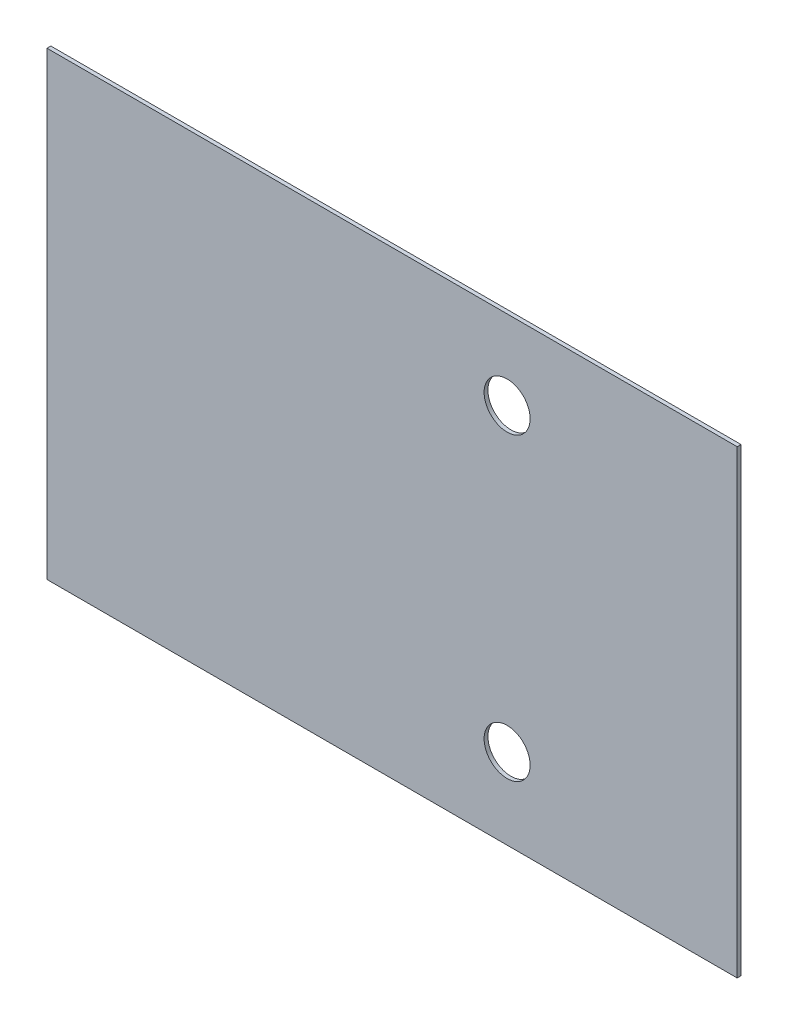
ISO-10303-21;
HEADER;
FILE_DESCRIPTION(('STEP AP214'),'2;1');
FILE_NAME('part.step','',(''),(''),'','','');
FILE_SCHEMA(('AUTOMOTIVE_DESIGN { 1 0 10303 214 1 1 1 1 }'));
ENDSEC;
DATA;
#1=APPLICATION_CONTEXT('core data for automotive mechanical design processes');
#2=APPLICATION_PROTOCOL_DEFINITION('international standard','automotive_design',2000,#1);
#3=PRODUCT_CONTEXT('',#1,'mechanical');
#4=PRODUCT('Part','Part','',(#3));
#5=PRODUCT_RELATED_PRODUCT_CATEGORY('part','',(#4));
#6=PRODUCT_DEFINITION_FORMATION('','',#4);
#7=PRODUCT_DEFINITION_CONTEXT('part definition',#1,'design');
#8=PRODUCT_DEFINITION('design','',#6,#7);
#9=PRODUCT_DEFINITION_SHAPE('','',#8);
#10=(LENGTH_UNIT() NAMED_UNIT(*) SI_UNIT(.MILLI.,.METRE.));
#11=(NAMED_UNIT(*) PLANE_ANGLE_UNIT() SI_UNIT($,.RADIAN.));
#12=(NAMED_UNIT(*) SI_UNIT($,.STERADIAN.) SOLID_ANGLE_UNIT());
#13=UNCERTAINTY_MEASURE_WITH_UNIT(LENGTH_MEASURE(1.E-05),#10,'distance_accuracy_value','');
#14=(GEOMETRIC_REPRESENTATION_CONTEXT(3) GLOBAL_UNCERTAINTY_ASSIGNED_CONTEXT((#13)) GLOBAL_UNIT_ASSIGNED_CONTEXT((#10,
#11,#12)) REPRESENTATION_CONTEXT('',''));
#15=CARTESIAN_POINT('',(0.,0.,0.));
#16=DIRECTION('',(0.,0.,1.));
#17=DIRECTION('',(1.,0.,0.));
#18=AXIS2_PLACEMENT_3D('',#15,#16,#17);
#19=CARTESIAN_POINT('',(475.545851528384,38.6462882096068,5.));
#20=DIRECTION('',(-1.,0.,0.));
#21=DIRECTION('',(0.,0.,1.));
#22=AXIS2_PLACEMENT_3D('',#19,#20,#21);
#23=PLANE('',#22);
#24=DIRECTION('',(0.,1.,0.));
#25=VECTOR('',#24,1.);
#26=CARTESIAN_POINT('',(475.545851528384,38.6462882096068,0.));
#27=LINE('',#26,#25);
#28=CARTESIAN_POINT('',(475.545851528384,38.6462882096068,0.));
#29=VERTEX_POINT('',#28);
#30=CARTESIAN_POINT('',(475.545851528384,638.646288209607,0.));
#31=VERTEX_POINT('',#30);
#32=EDGE_CURVE('E100',#29,#31,#27,.T.);
#33=ORIENTED_EDGE('',*,*,#32,.T.);
#34=DIRECTION('',(0.,0.,-1.));
#35=VECTOR('',#34,1.);
#36=CARTESIAN_POINT('',(475.545851528384,638.646288209607,5.));
#37=LINE('',#36,#35);
#38=CARTESIAN_POINT('',(475.545851528384,638.646288209607,5.));
#39=VERTEX_POINT('',#38);
#40=EDGE_CURVE('E11',#39,#31,#37,.T.);
#41=ORIENTED_EDGE('',*,*,#40,.F.);
#42=DIRECTION('',(0.,1.,0.));
#43=VECTOR('',#42,1.);
#44=CARTESIAN_POINT('',(475.545851528384,38.6462882096068,5.));
#45=LINE('',#44,#43);
#46=CARTESIAN_POINT('',(475.545851528384,38.6462882096068,5.));
#47=VERTEX_POINT('',#46);
#48=EDGE_CURVE('E88',#47,#39,#45,.T.);
#49=ORIENTED_EDGE('',*,*,#48,.F.);
#50=DIRECTION('',(0.,0.,-1.));
#51=VECTOR('',#50,1.);
#52=CARTESIAN_POINT('',(475.545851528384,38.6462882096068,5.));
#53=LINE('',#52,#51);
#54=EDGE_CURVE('E96',#47,#29,#53,.T.);
#55=ORIENTED_EDGE('',*,*,#54,.T.);
#56=EDGE_LOOP('',(#33,#41,#49,#55));
#57=FACE_BOUND('',#56,.T.);
#58=ADVANCED_FACE('F37',(#57),#23,.F.);
#59=CARTESIAN_POINT('',(475.545851528384,638.646288209607,5.));
#60=DIRECTION('',(0.,-1.,0.));
#61=DIRECTION('',(0.,0.,-1.));
#62=AXIS2_PLACEMENT_3D('',#59,#60,#61);
#63=PLANE('',#62);
#64=DIRECTION('',(-1.,0.,0.));
#65=VECTOR('',#64,1.);
#66=CARTESIAN_POINT('',(475.545851528384,638.646288209607,0.));
#67=LINE('',#66,#65);
#68=CARTESIAN_POINT('',(-424.454148471616,638.646288209607,0.));
#69=VERTEX_POINT('',#68);
#70=EDGE_CURVE('E92',#31,#69,#67,.T.);
#71=ORIENTED_EDGE('',*,*,#70,.T.);
#72=DIRECTION('',(0.,0.,-1.));
#73=VECTOR('',#72,1.);
#74=CARTESIAN_POINT('',(-424.454148471616,638.646288209607,5.));
#75=LINE('',#74,#73);
#76=CARTESIAN_POINT('',(-424.454148471616,638.646288209607,5.));
#77=VERTEX_POINT('',#76);
#78=EDGE_CURVE('E45',#77,#69,#75,.T.);
#79=ORIENTED_EDGE('',*,*,#78,.F.);
#80=DIRECTION('',(-1.,0.,0.));
#81=VECTOR('',#80,1.);
#82=CARTESIAN_POINT('',(475.545851528384,638.646288209607,5.));
#83=LINE('',#82,#81);
#84=EDGE_CURVE('E83',#39,#77,#83,.T.);
#85=ORIENTED_EDGE('',*,*,#84,.F.);
#86=ORIENTED_EDGE('',*,*,#40,.T.);
#87=EDGE_LOOP('',(#71,#79,#85,#86));
#88=FACE_BOUND('',#87,.T.);
#89=ADVANCED_FACE('F91',(#88),#63,.F.);
#90=CARTESIAN_POINT('',(-424.454148471616,38.6462882096067,5.));
#91=DIRECTION('',(1.,0.,0.));
#92=DIRECTION('',(0.,1.,0.));
#93=AXIS2_PLACEMENT_3D('',#90,#91,#92);
#94=PLANE('',#93);
#95=DIRECTION('',(0.,-1.,0.));
#96=VECTOR('',#95,1.);
#97=CARTESIAN_POINT('',(-424.454148471616,38.6462882096067,0.));
#98=LINE('',#97,#96);
#99=CARTESIAN_POINT('',(-424.454148471616,38.6462882096067,0.));
#100=VERTEX_POINT('',#99);
#101=EDGE_CURVE('E70',#69,#100,#98,.T.);
#102=ORIENTED_EDGE('',*,*,#101,.T.);
#103=DIRECTION('',(0.,0.,-1.));
#104=VECTOR('',#103,1.);
#105=CARTESIAN_POINT('',(-424.454148471616,38.6462882096067,5.));
#106=LINE('',#105,#104);
#107=CARTESIAN_POINT('',(-424.454148471616,38.6462882096067,5.));
#108=VERTEX_POINT('',#107);
#109=EDGE_CURVE('E93',#108,#100,#106,.T.);
#110=ORIENTED_EDGE('',*,*,#109,.F.);
#111=DIRECTION('',(0.,-1.,0.));
#112=VECTOR('',#111,1.);
#113=CARTESIAN_POINT('',(-424.454148471616,38.6462882096067,5.));
#114=LINE('',#113,#112);
#115=EDGE_CURVE('E86',#77,#108,#114,.T.);
#116=ORIENTED_EDGE('',*,*,#115,.F.);
#117=ORIENTED_EDGE('',*,*,#78,.T.);
#118=EDGE_LOOP('',(#102,#110,#116,#117));
#119=FACE_BOUND('',#118,.T.);
#120=ADVANCED_FACE('F94',(#119),#94,.F.);
#121=CARTESIAN_POINT('',(475.545851528384,38.6462882096068,5.));
#122=DIRECTION('',(0.,1.,0.));
#123=DIRECTION('',(-1.,0.,0.));
#124=AXIS2_PLACEMENT_3D('',#121,#122,#123);
#125=PLANE('',#124);
#126=DIRECTION('',(1.,0.,0.));
#127=VECTOR('',#126,1.);
#128=CARTESIAN_POINT('',(475.545851528384,38.6462882096068,0.));
#129=LINE('',#128,#127);
#130=EDGE_CURVE('E76',#100,#29,#129,.T.);
#131=ORIENTED_EDGE('',*,*,#130,.T.);
#132=ORIENTED_EDGE('',*,*,#54,.F.);
#133=DIRECTION('',(1.,0.,0.));
#134=VECTOR('',#133,1.);
#135=CARTESIAN_POINT('',(475.545851528384,38.6462882096068,5.));
#136=LINE('',#135,#134);
#137=EDGE_CURVE('E53',#108,#47,#136,.T.);
#138=ORIENTED_EDGE('',*,*,#137,.F.);
#139=ORIENTED_EDGE('',*,*,#109,.T.);
#140=EDGE_LOOP('',(#131,#132,#138,#139));
#141=FACE_BOUND('',#140,.T.);
#142=ADVANCED_FACE('F108',(#141),#125,.F.);
#143=CARTESIAN_POINT('',(0.,0.,5.));
#144=DIRECTION('',(0.,0.,1.));
#145=DIRECTION('',(1.,0.,0.));
#146=AXIS2_PLACEMENT_3D('',#143,#144,#145);
#147=PLANE('',#146);
#148=CARTESIAN_POINT('',(175.545851528384,143.938114846151,5.));
#149=DIRECTION('',(0.,0.,1.));
#150=DIRECTION('',(1.,0.,0.));
#151=AXIS2_PLACEMENT_3D('',#148,#149,#150);
#152=CIRCLE('',#151,30.0000000000001);
#153=CARTESIAN_POINT('',(205.545851528384,143.938114846151,5.));
#154=VERTEX_POINT('',#153);
#155=EDGE_CURVE('E119',#154,#154,#152,.T.);
#156=ORIENTED_EDGE('',*,*,#155,.F.);
#157=EDGE_LOOP('',(#156));
#158=FACE_BOUND('',#157,.T.);
#159=CARTESIAN_POINT('',(175.545851528384,535.128567936284,5.));
#160=DIRECTION('',(0.,0.,1.));
#161=DIRECTION('',(1.,0.,0.));
#162=AXIS2_PLACEMENT_3D('',#159,#160,#161);
#163=CIRCLE('',#162,30.0000000000001);
#164=CARTESIAN_POINT('',(205.545851528384,535.128567936284,5.));
#165=VERTEX_POINT('',#164);
#166=EDGE_CURVE('E103',#165,#165,#163,.T.);
#167=ORIENTED_EDGE('',*,*,#166,.F.);
#168=EDGE_LOOP('',(#167));
#169=FACE_BOUND('',#168,.T.);
#170=ORIENTED_EDGE('',*,*,#48,.T.);
#171=ORIENTED_EDGE('',*,*,#84,.T.);
#172=ORIENTED_EDGE('',*,*,#115,.T.);
#173=ORIENTED_EDGE('',*,*,#137,.T.);
#174=EDGE_LOOP('',(#170,#171,#172,#173));
#175=FACE_BOUND('',#174,.T.);
#176=ADVANCED_FACE('F84',(#158,#169,#175),#147,.T.);
#177=CARTESIAN_POINT('',(0.,0.,0.));
#178=DIRECTION('',(0.,0.,1.));
#179=DIRECTION('',(1.,0.,0.));
#180=AXIS2_PLACEMENT_3D('',#177,#178,#179);
#181=PLANE('',#180);
#182=CARTESIAN_POINT('',(175.545851528384,143.938114846151,0.));
#183=DIRECTION('',(0.,0.,-1.));
#184=DIRECTION('',(-1.,0.,0.));
#185=AXIS2_PLACEMENT_3D('',#182,#183,#184);
#186=CIRCLE('',#185,30.0000000000001);
#187=CARTESIAN_POINT('',(145.545851528384,143.938114846151,0.));
#188=VERTEX_POINT('',#187);
#189=EDGE_CURVE('E122',#188,#188,#186,.T.);
#190=ORIENTED_EDGE('',*,*,#189,.F.);
#191=EDGE_LOOP('',(#190));
#192=FACE_BOUND('',#191,.T.);
#193=CARTESIAN_POINT('',(175.545851528384,535.128567936284,0.));
#194=DIRECTION('',(0.,0.,-1.));
#195=DIRECTION('',(-1.,0.,0.));
#196=AXIS2_PLACEMENT_3D('',#193,#194,#195);
#197=CIRCLE('',#196,30.0000000000001);
#198=CARTESIAN_POINT('',(145.545851528384,535.128567936284,0.));
#199=VERTEX_POINT('',#198);
#200=EDGE_CURVE('E116',#199,#199,#197,.T.);
#201=ORIENTED_EDGE('',*,*,#200,.F.);
#202=EDGE_LOOP('',(#201));
#203=FACE_BOUND('',#202,.T.);
#204=ORIENTED_EDGE('',*,*,#32,.F.);
#205=ORIENTED_EDGE('',*,*,#130,.F.);
#206=ORIENTED_EDGE('',*,*,#101,.F.);
#207=ORIENTED_EDGE('',*,*,#70,.F.);
#208=EDGE_LOOP('',(#204,#205,#206,#207));
#209=FACE_BOUND('',#208,.T.);
#210=ADVANCED_FACE('F111',(#192,#203,#209),#181,.F.);
#211=CARTESIAN_POINT('',(175.545851528384,535.128567936284,10.));
#212=DIRECTION('',(0.,0.,-1.));
#213=DIRECTION('',(-1.,0.,0.));
#214=AXIS2_PLACEMENT_3D('',#211,#212,#213);
#215=CYLINDRICAL_SURFACE('',#214,30.0000000000001);
#216=ORIENTED_EDGE('',*,*,#166,.T.);
#217=EDGE_LOOP('',(#216));
#218=FACE_BOUND('',#217,.T.);
#219=ORIENTED_EDGE('',*,*,#200,.T.);
#220=EDGE_LOOP('',(#219));
#221=FACE_BOUND('',#220,.T.);
#222=ADVANCED_FACE('F130',(#218,#221),#215,.F.);
#223=CARTESIAN_POINT('',(175.545851528384,143.938114846151,10.));
#224=DIRECTION('',(0.,0.,-1.));
#225=DIRECTION('',(-1.,0.,0.));
#226=AXIS2_PLACEMENT_3D('',#223,#224,#225);
#227=CYLINDRICAL_SURFACE('',#226,30.0000000000001);
#228=ORIENTED_EDGE('',*,*,#155,.T.);
#229=EDGE_LOOP('',(#228));
#230=FACE_BOUND('',#229,.T.);
#231=ORIENTED_EDGE('',*,*,#189,.T.);
#232=EDGE_LOOP('',(#231));
#233=FACE_BOUND('',#232,.T.);
#234=ADVANCED_FACE('F126',(#230,#233),#227,.F.);
#235=CLOSED_SHELL('',(#58,#89,#120,#142,#176,#210,#222,#234));
#236=MANIFOLD_SOLID_BREP('B2',#235);
#237=ADVANCED_BREP_SHAPE_REPRESENTATION('',(#18,#236),#14);
#238=SHAPE_DEFINITION_REPRESENTATION(#9,#237);
ENDSEC;
END-ISO-10303-21;
